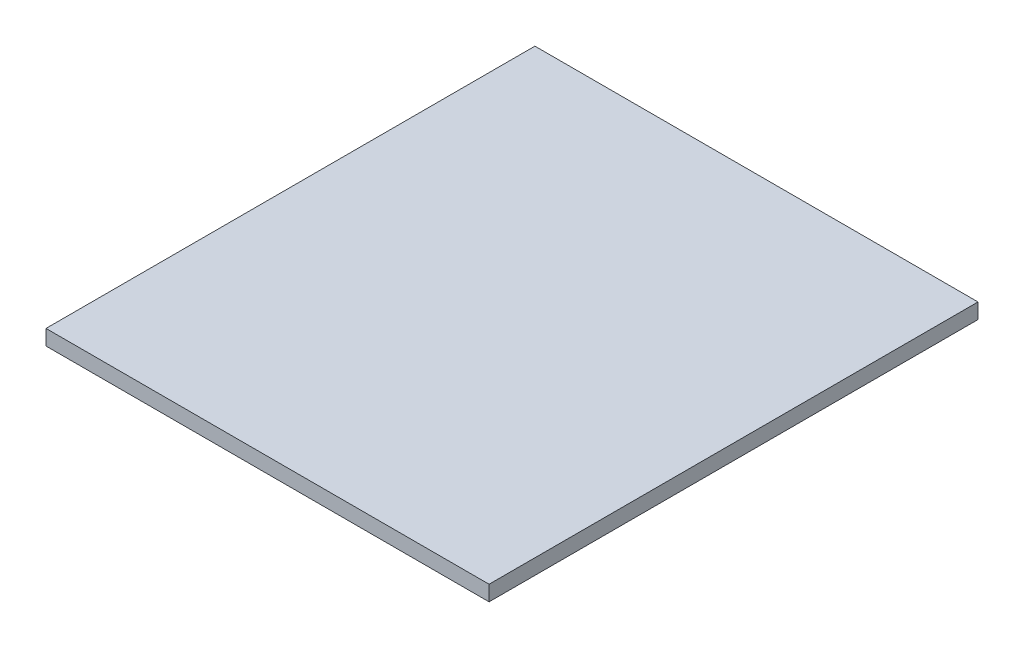
ISO-10303-21;
HEADER;
FILE_DESCRIPTION(('STEP AP214'),'2;1');
FILE_NAME('part.step','',(''),(''),'','','');
FILE_SCHEMA(('AUTOMOTIVE_DESIGN { 1 0 10303 214 1 1 1 1 }'));
ENDSEC;
DATA;
#1=APPLICATION_CONTEXT('core data for automotive mechanical design processes');
#2=APPLICATION_PROTOCOL_DEFINITION('international standard','automotive_design',2000,#1);
#3=PRODUCT_CONTEXT('',#1,'mechanical');
#4=PRODUCT('Part','Part','',(#3));
#5=PRODUCT_RELATED_PRODUCT_CATEGORY('part','',(#4));
#6=PRODUCT_DEFINITION_FORMATION('','',#4);
#7=PRODUCT_DEFINITION_CONTEXT('part definition',#1,'design');
#8=PRODUCT_DEFINITION('design','',#6,#7);
#9=PRODUCT_DEFINITION_SHAPE('','',#8);
#10=(LENGTH_UNIT() NAMED_UNIT(*) SI_UNIT(.MILLI.,.METRE.));
#11=(NAMED_UNIT(*) PLANE_ANGLE_UNIT() SI_UNIT($,.RADIAN.));
#12=(NAMED_UNIT(*) SI_UNIT($,.STERADIAN.) SOLID_ANGLE_UNIT());
#13=UNCERTAINTY_MEASURE_WITH_UNIT(LENGTH_MEASURE(1.E-05),#10,'distance_accuracy_value','');
#14=(GEOMETRIC_REPRESENTATION_CONTEXT(3) GLOBAL_UNCERTAINTY_ASSIGNED_CONTEXT((#13)) GLOBAL_UNIT_ASSIGNED_CONTEXT((#10,
#11,#12)) REPRESENTATION_CONTEXT('',''));
#15=CARTESIAN_POINT('',(0.,0.,0.));
#16=DIRECTION('',(0.,0.,1.));
#17=DIRECTION('',(1.,0.,0.));
#18=AXIS2_PLACEMENT_3D('',#15,#16,#17);
#19=CARTESIAN_POINT('',(40.,1300.,-460.));
#20=DIRECTION('',(-1.,0.,0.));
#21=DIRECTION('',(0.,0.,1.));
#22=AXIS2_PLACEMENT_3D('',#19,#20,#21);
#23=PLANE('',#22);
#24=DIRECTION('',(0.,-1.,0.));
#25=VECTOR('',#24,1.);
#26=CARTESIAN_POINT('',(40.,1300.,-140.));
#27=LINE('',#26,#25);
#28=CARTESIAN_POINT('',(40.,1310.,-140.));
#29=VERTEX_POINT('',#28);
#30=CARTESIAN_POINT('',(40.,1300.,-140.));
#31=VERTEX_POINT('',#30);
#32=EDGE_CURVE('E103',#29,#31,#27,.T.);
#33=ORIENTED_EDGE('',*,*,#32,.F.);
#34=DIRECTION('',(0.,0.,1.));
#35=VECTOR('',#34,1.);
#36=CARTESIAN_POINT('',(40.,1310.,-460.));
#37=LINE('',#36,#35);
#38=CARTESIAN_POINT('',(40.,1310.,-460.));
#39=VERTEX_POINT('',#38);
#40=EDGE_CURVE('E11',#39,#29,#37,.T.);
#41=ORIENTED_EDGE('',*,*,#40,.F.);
#42=DIRECTION('',(0.,-1.,0.));
#43=VECTOR('',#42,1.);
#44=CARTESIAN_POINT('',(40.,1300.,-460.));
#45=LINE('',#44,#43);
#46=CARTESIAN_POINT('',(40.,1300.,-460.));
#47=VERTEX_POINT('',#46);
#48=EDGE_CURVE('E97',#39,#47,#45,.T.);
#49=ORIENTED_EDGE('',*,*,#48,.T.);
#50=DIRECTION('',(0.,0.,1.));
#51=VECTOR('',#50,1.);
#52=CARTESIAN_POINT('',(40.,1300.,-460.));
#53=LINE('',#52,#51);
#54=EDGE_CURVE('E42',#47,#31,#53,.T.);
#55=ORIENTED_EDGE('',*,*,#54,.T.);
#56=EDGE_LOOP('',(#33,#41,#49,#55));
#57=FACE_BOUND('',#56,.T.);
#58=ADVANCED_FACE('F39',(#57),#23,.T.);
#59=CARTESIAN_POINT('',(40.,1310.,-460.));
#60=DIRECTION('',(0.,1.,0.));
#61=DIRECTION('',(0.,0.,1.));
#62=AXIS2_PLACEMENT_3D('',#59,#60,#61);
#63=PLANE('',#62);
#64=DIRECTION('',(-1.,0.,0.));
#65=VECTOR('',#64,1.);
#66=CARTESIAN_POINT('',(40.,1310.,-140.));
#67=LINE('',#66,#65);
#68=CARTESIAN_POINT('',(330.,1310.,-140.));
#69=VERTEX_POINT('',#68);
#70=EDGE_CURVE('E99',#69,#29,#67,.T.);
#71=ORIENTED_EDGE('',*,*,#70,.F.);
#72=DIRECTION('',(0.,0.,1.));
#73=VECTOR('',#72,1.);
#74=CARTESIAN_POINT('',(330.,1310.,-460.));
#75=LINE('',#74,#73);
#76=CARTESIAN_POINT('',(330.,1310.,-460.));
#77=VERTEX_POINT('',#76);
#78=EDGE_CURVE('E48',#77,#69,#75,.T.);
#79=ORIENTED_EDGE('',*,*,#78,.F.);
#80=DIRECTION('',(-1.,0.,0.));
#81=VECTOR('',#80,1.);
#82=CARTESIAN_POINT('',(40.,1310.,-460.));
#83=LINE('',#82,#81);
#84=EDGE_CURVE('E94',#77,#39,#83,.T.);
#85=ORIENTED_EDGE('',*,*,#84,.T.);
#86=ORIENTED_EDGE('',*,*,#40,.T.);
#87=EDGE_LOOP('',(#71,#79,#85,#86));
#88=FACE_BOUND('',#87,.T.);
#89=ADVANCED_FACE('F113',(#88),#63,.T.);
#90=CARTESIAN_POINT('',(330.,1300.,-460.));
#91=DIRECTION('',(1.,0.,0.));
#92=DIRECTION('',(0.,0.,-1.));
#93=AXIS2_PLACEMENT_3D('',#90,#91,#92);
#94=PLANE('',#93);
#95=DIRECTION('',(0.,1.,0.));
#96=VECTOR('',#95,1.);
#97=CARTESIAN_POINT('',(330.,1300.,-140.));
#98=LINE('',#97,#96);
#99=CARTESIAN_POINT('',(330.,1300.,-140.));
#100=VERTEX_POINT('',#99);
#101=EDGE_CURVE('E89',#100,#69,#98,.T.);
#102=ORIENTED_EDGE('',*,*,#101,.F.);
#103=DIRECTION('',(0.,0.,1.));
#104=VECTOR('',#103,1.);
#105=CARTESIAN_POINT('',(330.,1300.,-460.));
#106=LINE('',#105,#104);
#107=CARTESIAN_POINT('',(330.,1300.,-460.));
#108=VERTEX_POINT('',#107);
#109=EDGE_CURVE('E84',#108,#100,#106,.T.);
#110=ORIENTED_EDGE('',*,*,#109,.F.);
#111=DIRECTION('',(0.,1.,0.));
#112=VECTOR('',#111,1.);
#113=CARTESIAN_POINT('',(330.,1300.,-460.));
#114=LINE('',#113,#112);
#115=EDGE_CURVE('E87',#108,#77,#114,.T.);
#116=ORIENTED_EDGE('',*,*,#115,.T.);
#117=ORIENTED_EDGE('',*,*,#78,.T.);
#118=EDGE_LOOP('',(#102,#110,#116,#117));
#119=FACE_BOUND('',#118,.T.);
#120=ADVANCED_FACE('F86',(#119),#94,.T.);
#121=CARTESIAN_POINT('',(40.,1300.,-460.));
#122=DIRECTION('',(0.,-1.,0.));
#123=DIRECTION('',(0.,0.,-1.));
#124=AXIS2_PLACEMENT_3D('',#121,#122,#123);
#125=PLANE('',#124);
#126=DIRECTION('',(1.,0.,0.));
#127=VECTOR('',#126,1.);
#128=CARTESIAN_POINT('',(40.,1300.,-140.));
#129=LINE('',#128,#127);
#130=EDGE_CURVE('E106',#31,#100,#129,.T.);
#131=ORIENTED_EDGE('',*,*,#130,.F.);
#132=ORIENTED_EDGE('',*,*,#54,.F.);
#133=DIRECTION('',(1.,0.,0.));
#134=VECTOR('',#133,1.);
#135=CARTESIAN_POINT('',(40.,1300.,-460.));
#136=LINE('',#135,#134);
#137=EDGE_CURVE('E93',#47,#108,#136,.T.);
#138=ORIENTED_EDGE('',*,*,#137,.T.);
#139=ORIENTED_EDGE('',*,*,#109,.T.);
#140=EDGE_LOOP('',(#131,#132,#138,#139));
#141=FACE_BOUND('',#140,.T.);
#142=ADVANCED_FACE('F96',(#141),#125,.T.);
#143=CARTESIAN_POINT('',(0.,0.,-460.));
#144=DIRECTION('',(0.,0.,-1.));
#145=DIRECTION('',(-1.,0.,0.));
#146=AXIS2_PLACEMENT_3D('',#143,#144,#145);
#147=PLANE('',#146);
#148=ORIENTED_EDGE('',*,*,#48,.F.);
#149=ORIENTED_EDGE('',*,*,#84,.F.);
#150=ORIENTED_EDGE('',*,*,#115,.F.);
#151=ORIENTED_EDGE('',*,*,#137,.F.);
#152=EDGE_LOOP('',(#148,#149,#150,#151));
#153=FACE_BOUND('',#152,.T.);
#154=ADVANCED_FACE('F92',(#153),#147,.T.);
#155=CARTESIAN_POINT('',(0.,0.,-140.));
#156=DIRECTION('',(0.,0.,-1.));
#157=DIRECTION('',(-1.,0.,0.));
#158=AXIS2_PLACEMENT_3D('',#155,#156,#157);
#159=PLANE('',#158);
#160=ORIENTED_EDGE('',*,*,#32,.T.);
#161=ORIENTED_EDGE('',*,*,#130,.T.);
#162=ORIENTED_EDGE('',*,*,#101,.T.);
#163=ORIENTED_EDGE('',*,*,#70,.T.);
#164=EDGE_LOOP('',(#160,#161,#162,#163));
#165=FACE_BOUND('',#164,.T.);
#166=ADVANCED_FACE('F112',(#165),#159,.F.);
#167=CLOSED_SHELL('',(#58,#89,#120,#142,#154,#166));
#168=MANIFOLD_SOLID_BREP('B2',#167);
#169=ADVANCED_BREP_SHAPE_REPRESENTATION('',(#18,#168),#14);
#170=SHAPE_DEFINITION_REPRESENTATION(#9,#169);
ENDSEC;
END-ISO-10303-21;
